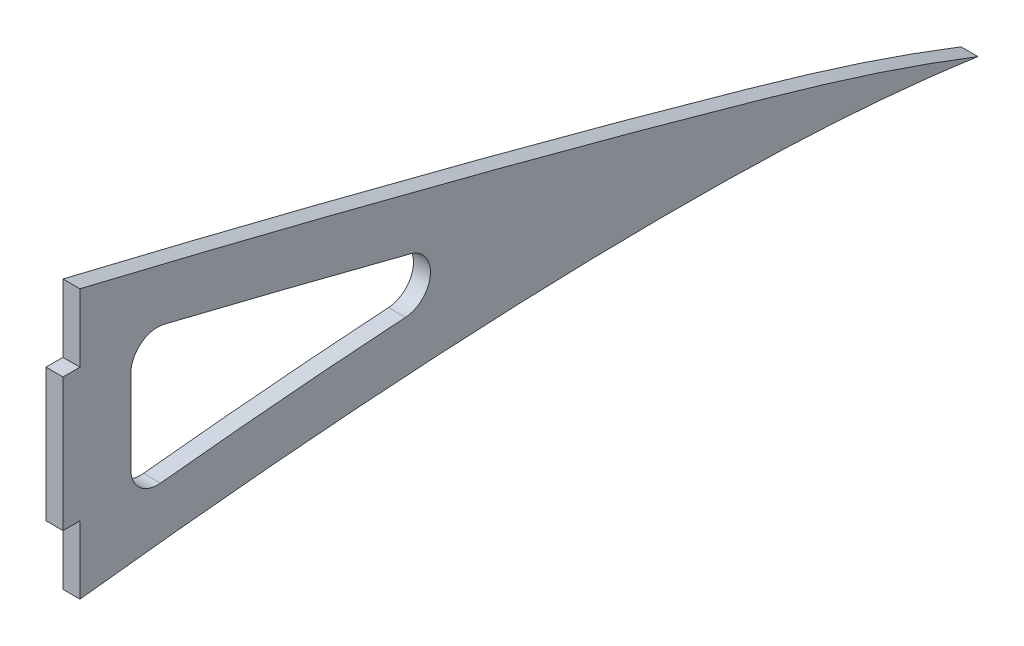
ISO-10303-21;
HEADER;
FILE_DESCRIPTION(('STEP AP214'),'2;1');
FILE_NAME('part.step','',(''),(''),'','','');
FILE_SCHEMA(('AUTOMOTIVE_DESIGN { 1 0 10303 214 1 1 1 1 }'));
ENDSEC;
DATA;
#1=APPLICATION_CONTEXT('core data for automotive mechanical design processes');
#2=APPLICATION_PROTOCOL_DEFINITION('international standard','automotive_design',2000,#1);
#3=PRODUCT_CONTEXT('',#1,'mechanical');
#4=PRODUCT('Part','Part','',(#3));
#5=PRODUCT_RELATED_PRODUCT_CATEGORY('part','',(#4));
#6=PRODUCT_DEFINITION_FORMATION('','',#4);
#7=PRODUCT_DEFINITION_CONTEXT('part definition',#1,'design');
#8=PRODUCT_DEFINITION('design','',#6,#7);
#9=PRODUCT_DEFINITION_SHAPE('','',#8);
#10=(LENGTH_UNIT() NAMED_UNIT(*) SI_UNIT(.MILLI.,.METRE.));
#11=(NAMED_UNIT(*) PLANE_ANGLE_UNIT() SI_UNIT($,.RADIAN.));
#12=(NAMED_UNIT(*) SI_UNIT($,.STERADIAN.) SOLID_ANGLE_UNIT());
#13=UNCERTAINTY_MEASURE_WITH_UNIT(LENGTH_MEASURE(1.E-05),#10,'distance_accuracy_value','');
#14=(GEOMETRIC_REPRESENTATION_CONTEXT(3) GLOBAL_UNCERTAINTY_ASSIGNED_CONTEXT((#13)) GLOBAL_UNIT_ASSIGNED_CONTEXT((#10,
#11,#12)) REPRESENTATION_CONTEXT('',''));
#15=CARTESIAN_POINT('',(0.,0.,0.));
#16=DIRECTION('',(0.,0.,1.));
#17=DIRECTION('',(1.,0.,0.));
#18=AXIS2_PLACEMENT_3D('',#15,#16,#17);
#19=CARTESIAN_POINT('',(1.5875,0.,0.));
#20=DIRECTION('',(1.,0.,0.));
#21=DIRECTION('',(0.,0.,-1.));
#22=AXIS2_PLACEMENT_3D('',#19,#20,#21);
#23=PLANE('',#22);
#24=DIRECTION('',(0.,1.,1.66096358014787E-13));
#25=VECTOR('',#24,1.);
#26=CARTESIAN_POINT('',(1.5875,1.02331310656789E-10,-616.096053398588));
#27=LINE('',#26,#25);
#28=CARTESIAN_POINT('',(1.5875,-27.0322599546339,-616.096053398592));
#29=VERTEX_POINT('',#28);
#30=CARTESIAN_POINT('',(1.5875,-14.3322599546339,-616.09605339859));
#31=VERTEX_POINT('',#30);
#32=EDGE_CURVE('E134',#29,#31,#27,.T.);
#33=ORIENTED_EDGE('',*,*,#32,.F.);
#34=CARTESIAN_POINT('',(1.5875,-0.0168698697803817,-1.58896756731634));
#35=CARTESIAN_POINT('',(1.5875,-0.278093575405853,-1.59778567538342));
#36=CARTESIAN_POINT('',(1.5875,-0.817071560687652,-1.61698852295705));
#37=CARTESIAN_POINT('',(1.5875,-1.5250777063707,-1.67055282833132));
#38=CARTESIAN_POINT('',(1.5875,-2.23953985681244,-1.77272911801303));
#39=CARTESIAN_POINT('',(1.5875,-3.2170399545111,-1.96449824112025));
#40=CARTESIAN_POINT('',(1.5875,-4.47308667544305,-2.28220569209763));
#41=CARTESIAN_POINT('',(1.5875,-6.45569044251883,-2.89195735088694));
#42=CARTESIAN_POINT('',(1.5875,-8.91270651117956,-3.82502314776842));
#43=CARTESIAN_POINT('',(1.5875,-12.764870838745,-5.5748206630622));
#44=CARTESIAN_POINT('',(1.5875,-17.4946939025467,-8.15485573251682));
#45=CARTESIAN_POINT('',(1.5875,-25.0362925123383,-12.5101141172109));
#46=CARTESIAN_POINT('',(1.5875,-34.2942736430627,-18.1123469115671));
#47=CARTESIAN_POINT('',(1.5875,-45.1810251619868,-25.230105591362));
#48=CARTESIAN_POINT('',(1.5875,-53.8227317037622,-31.689080193494));
#49=CARTESIAN_POINT('',(1.5875,-60.4726069561864,-37.2128263714012));
#50=CARTESIAN_POINT('',(1.5875,-66.962933883926,-42.9501181028563));
#51=CARTESIAN_POINT('',(1.5875,-74.4394415189749,-50.6018486257846));
#52=CARTESIAN_POINT('',(1.5875,-81.5128401744618,-61.3489491705267));
#53=CARTESIAN_POINT('',(1.5875,-86.5672767678429,-73.159446713042));
#54=CARTESIAN_POINT('',(1.5875,-90.1112052326867,-85.6410448979768));
#55=CARTESIAN_POINT('',(1.5875,-92.857558138955,-98.3222524640694));
#56=CARTESIAN_POINT('',(1.5875,-95.4884593166877,-115.423728280371));
#57=CARTESIAN_POINT('',(1.5875,-97.1574166185787,-137.057042994171));
#58=CARTESIAN_POINT('',(1.5875,-97.3913575328663,-163.09710904146));
#59=CARTESIAN_POINT('',(1.5875,-96.2564047503436,-189.13539327614));
#60=CARTESIAN_POINT('',(1.5875,-94.0860606996018,-215.119495237718));
#61=CARTESIAN_POINT('',(1.5875,-91.1098097619557,-241.033805840036));
#62=CARTESIAN_POINT('',(1.5875,-86.3075505253941,-275.492090275555));
#63=CARTESIAN_POINT('',(1.5875,-79.1224787107728,-318.404073319138));
#64=CARTESIAN_POINT('',(1.5875,-69.4844112272533,-369.735601224399));
#65=CARTESIAN_POINT('',(1.5875,-59.4768027176839,-421.013521647914));
#66=CARTESIAN_POINT('',(1.5875,-49.6150737617801,-472.334965082267));
#67=CARTESIAN_POINT('',(1.5875,-40.3589258634731,-523.784524343132));
#68=CARTESIAN_POINT('',(1.5875,-33.4141676050394,-567.397032140983));
#69=CARTESIAN_POINT('',(1.5875,-28.6192917774646,-602.524816758193));
#70=CARTESIAN_POINT('',(1.5875,-24.5175461399527,-637.156841221714));
#71=CARTESIAN_POINT('',(1.5875,-21.4749055065338,-671.327266418194));
#72=CARTESIAN_POINT('',(1.5875,-19.8162969755378,-705.603952790565));
#73=CARTESIAN_POINT('',(1.5875,-19.41220767749,-731.78903132868));
#74=CARTESIAN_POINT('',(1.5875,-20.1502189024007,-758.00034587372));
#75=CARTESIAN_POINT('',(1.5875,-21.867269156407,-775.446944988084));
#76=CARTESIAN_POINT('',(1.5875,-23.1184231765888,-784.106482277342));
#77=B_SPLINE_CURVE_WITH_KNOTS('',3,(#34,#35,#36,#37,#38,#39,#40,#41,#42,#43,#44,#45,#46,#47,#48,
#49,#50,#51,#52,#53,#54,#55,#56,#57,#58,#59,#60,#61,#62,#63,#64,#65,#66,#67,#68,#69,#70,#71,#72,
#73,#74,#75,#76),.UNSPECIFIED.,.F.,.F.,(4,1,1,1,1,1,1,1,1,1,1,1,1,1,1,1,1,1,1,1,1,1,1,1,1,1,1,1,
1,1,1,1,1,1,1,1,1,1,1,1,4),(8.23654502113766E-05,0.00103762246756374,0.00199287948491611,
0.00294813650226847,0.00390339351962084,0.00581390755432556,0.00772442158903029,
0.0115454496584398,0.0153664777278492,0.0230085338666681,0.030650590005487,0.0459347022831249,
0.0612188145607627,0.0765029268384006,0.0841449829772195,0.0917870391160384,0.107071151393676,
0.122355263671314,0.137639375948952,0.15292348822659,0.168207600504228,0.183491712781865,
0.214059937337141,0.244628161892417,0.275196386447692,0.305764611002968,0.336332835558244,
0.366901060113519,0.428037509224071,0.489173958334622,0.550310407445173,0.611446856555725,
0.672583305666276,0.733719754776827,0.766341569027321,0.796909793582597,0.85599265299793,
0.886560877553206,0.917129102108482,0.947697326663757,0.978265551219033),.UNSPECIFIED.);
#78=CARTESIAN_POINT('',(1.5875,-23.1184231765888,-784.106482277342));
#79=VERTEX_POINT('',#78);
#80=EDGE_CURVE('E144',#29,#79,#77,.T.);
#81=ORIENTED_EDGE('',*,*,#80,.T.);
#82=CARTESIAN_POINT('',(1.5875,-23.1184231765888,-784.106482277342));
#83=CARTESIAN_POINT('',(1.5875,-21.5941948646314,-780.160330066746));
#84=CARTESIAN_POINT('',(1.5875,-18.6420313640257,-772.229019430764));
#85=CARTESIAN_POINT('',(1.5875,-14.6721592573552,-760.174514143023));
#86=CARTESIAN_POINT('',(1.5875,-11.061270892252,-747.991113763068));
#87=CARTESIAN_POINT('',(1.5875,-6.45595444735922,-731.645658465396));
#88=CARTESIAN_POINT('',(1.5875,-0.845295728828582,-711.176791695));
#89=CARTESIAN_POINT('',(1.5875,7.48755270465738,-679.558994763352));
#90=CARTESIAN_POINT('',(1.5875,14.4995617444176,-651.983641843664));
#91=CARTESIAN_POINT('',(1.5875,21.2911002500126,-624.354900685818));
#92=CARTESIAN_POINT('',(1.5875,25.5546603839251,-606.604777538299));
#93=CARTESIAN_POINT('',(1.5875,32.596548420524,-576.424151958469));
#94=CARTESIAN_POINT('',(1.5875,41.1374524116112,-537.877742251688));
#95=CARTESIAN_POINT('',(1.5875,51.0911698472495,-487.918910070674));
#96=CARTESIAN_POINT('',(1.5875,59.7239737986415,-437.720761599895));
#97=CARTESIAN_POINT('',(1.5875,66.7289053590127,-387.278741139135));
#98=CARTESIAN_POINT('',(1.5875,70.9360377288318,-345.050560772716));
#99=CARTESIAN_POINT('',(1.5875,73.0641477653892,-311.18788932569));
#100=CARTESIAN_POINT('',(1.5875,74.2092196354668,-277.279562300467));
#101=CARTESIAN_POINT('',(1.5875,73.8800008847884,-243.342738652409));
#102=CARTESIAN_POINT('',(1.5875,71.9586220108794,-209.476353678726));
#103=CARTESIAN_POINT('',(1.5875,69.6475228760495,-184.143820783248));
#104=CARTESIAN_POINT('',(1.5875,66.4677558472745,-158.904994034112));
#105=CARTESIAN_POINT('',(1.5875,62.3586391617327,-133.8071867013));
#106=CARTESIAN_POINT('',(1.5875,57.1874016990518,-108.915504076387));
#107=CARTESIAN_POINT('',(1.5875,51.8354380146184,-88.4250104282845));
#108=CARTESIAN_POINT('',(1.5875,46.781142415969,-72.2737715807522));
#109=CARTESIAN_POINT('',(1.5875,42.5401308058817,-60.3184424568568));
#110=CARTESIAN_POINT('',(1.5875,37.7737253953122,-48.577097756103));
#111=CARTESIAN_POINT('',(1.5875,32.3878283625538,-37.1196846287895));
#112=CARTESIAN_POINT('',(1.5875,27.2537575462737,-27.9271564923142));
#113=CARTESIAN_POINT('',(1.5875,22.6553737471211,-20.9063850305832));
#114=CARTESIAN_POINT('',(1.5875,18.9075077927961,-15.8717047100105));
#115=CARTESIAN_POINT('',(1.5875,14.8240531255331,-11.1186200473068));
#116=CARTESIAN_POINT('',(1.5875,11.0807152552971,-7.55821558571599));
#117=CARTESIAN_POINT('',(1.5875,7.83489505129662,-5.02510578688502));
#118=CARTESIAN_POINT('',(1.5875,5.29547537768222,-3.38923844421585));
#119=CARTESIAN_POINT('',(1.5875,3.06142620290842,-2.31109107008206));
#120=CARTESIAN_POINT('',(1.5875,1.48593186176602,-1.80559091181272));
#121=CARTESIAN_POINT('',(1.5875,0.72579482126348,-1.65397388534357));
#122=CARTESIAN_POINT('',(1.5875,0.34989447911426,-1.61043534130219));
#123=CARTESIAN_POINT('',(1.5875,0.100324503404875,-1.59546044383819));
#124=CARTESIAN_POINT('',(1.5875,-0.0168698697803871,-1.58896756731634));
#125=B_SPLINE_CURVE_WITH_KNOTS('',3,(#82,#83,#84,#85,#86,#87,#88,#89,#90,#91,#92,#93,#94,#95,
#96,#97,#98,#99,#100,#101,#102,#103,#104,#105,#106,#107,#108,#109,#110,#111,#112,#113,#114,#115,
#116,#117,#118,#119,#120,#121,#122,#123,#124),.UNSPECIFIED.,.F.,.F.,(4,1,1,1,1,1,1,1,1,1,1,1,1,
1,1,1,1,1,1,1,1,1,1,1,1,1,1,1,1,1,1,1,1,1,1,1,1,1,1,1,4),(0.0222996498274626,0.0375748876942013,
0.05285012556094,0.0681253634276787,0.0834006012944174,0.113951077027895,0.144501552761372,
0.201029282441029,0.216304520307768,0.246854996041246,0.266703455695282,0.327804407162237,
0.388905358629191,0.450006310096146,0.511107261563101,0.572208213030056,0.602758688763533,
0.633309164497011,0.694410115963965,0.724960591697443,0.75551106743092,0.786061543164398,
0.816612018897875,0.847162494631353,0.87771297036483,0.892988208231569,0.908263446098307,
0.923538683965046,0.938813921831785,0.954089159698523,0.961726778631893,0.969364397565262,
0.977002016498631,0.984639635432001,0.988458444898685,0.99227725436537,0.996096063832055,
0.998005468565397,0.998960170932068,0.999437522115404,0.999914873298739),.UNSPECIFIED.);
#126=CARTESIAN_POINT('',(1.5875,23.2667001377275,-616.09605339859));
#127=VERTEX_POINT('',#126);
#128=EDGE_CURVE('E149',#79,#127,#125,.T.);
#129=ORIENTED_EDGE('',*,*,#128,.T.);
#130=DIRECTION('',(0.,-1.,0.));
#131=VECTOR('',#130,1.);
#132=CARTESIAN_POINT('',(1.5875,0.,-616.09605339859));
#133=LINE('',#132,#131);
#134=CARTESIAN_POINT('',(1.5875,10.5667001377275,-616.09605339859));
#135=VERTEX_POINT('',#134);
#136=EDGE_CURVE('E440',#127,#135,#133,.T.);
#137=ORIENTED_EDGE('',*,*,#136,.T.);
#138=DIRECTION('',(0.,0.,1.));
#139=VECTOR('',#138,1.);
#140=CARTESIAN_POINT('',(1.5875,10.5667001377275,0.));
#141=LINE('',#140,#139);
#142=CARTESIAN_POINT('',(1.5875,10.5667001377275,-612.921053398607));
#143=VERTEX_POINT('',#142);
#144=EDGE_CURVE('E240',#135,#143,#141,.T.);
#145=ORIENTED_EDGE('',*,*,#144,.T.);
#146=DIRECTION('',(0.,-1.,0.));
#147=VECTOR('',#146,1.);
#148=CARTESIAN_POINT('',(1.5875,0.,-612.921053398607));
#149=LINE('',#148,#147);
#150=CARTESIAN_POINT('',(1.5875,-14.3322599546339,-612.921053398607));
#151=VERTEX_POINT('',#150);
#152=EDGE_CURVE('E441',#143,#151,#149,.T.);
#153=ORIENTED_EDGE('',*,*,#152,.T.);
#154=DIRECTION('',(0.,0.,1.));
#155=VECTOR('',#154,1.);
#156=CARTESIAN_POINT('',(1.5875,-14.3322599546339,0.));
#157=LINE('',#156,#155);
#158=EDGE_CURVE('E152',#31,#151,#157,.T.);
#159=ORIENTED_EDGE('',*,*,#158,.F.);
#160=EDGE_LOOP('',(#33,#81,#129,#137,#145,#153,#159));
#161=FACE_BOUND('',#160,.T.);
#162=CARTESIAN_POINT('',(1.5875,-16.3575336813235,-625.62105339859));
#163=CARTESIAN_POINT('',(1.5875,-15.5904703771703,-632.578353092105));
#164=CARTESIAN_POINT('',(1.5875,-14.1649136416022,-646.49830930104));
#165=CARTESIAN_POINT('',(1.5875,-12.4003350236003,-667.454887979884));
#166=CARTESIAN_POINT('',(1.5875,-11.0652895824429,-688.462893644439));
#167=CARTESIAN_POINT('',(1.5875,-10.5016999291603,-702.52523707711));
#168=CARTESIAN_POINT('',(1.5875,-10.315598480717,-709.553781788835));
#169=B_SPLINE_CURVE_WITH_KNOTS('',3,(#162,#163,#164,#165,#166,#167,#168),.UNSPECIFIED.,.F.,.F.,
(4,1,1,1,4),(0.868429491787277,0.892780478576909,0.91713146536654,0.941482452156172,
0.965833438945803),.UNSPECIFIED.);
#170=CARTESIAN_POINT('',(1.5875,-15.759804026355,-631.148140493534));
#171=VERTEX_POINT('',#170);
#172=CARTESIAN_POINT('',(1.5875,-11.8137429156262,-676.991682383172));
#173=VERTEX_POINT('',#172);
#174=EDGE_CURVE('E302',#171,#173,#169,.T.);
#175=ORIENTED_EDGE('',*,*,#174,.F.);
#176=CARTESIAN_POINT('',(1.5875,-10.7876637231913,-630.621053398591));
#177=DIRECTION('',(1.,0.,0.));
#178=DIRECTION('',(0.,0.,-1.));
#179=AXIS2_PLACEMENT_3D('',#176,#177,#178);
#180=CIRCLE('',#179,5.);
#181=CARTESIAN_POINT('',(1.5875,-10.787663723191,-625.621053398591));
#182=VERTEX_POINT('',#181);
#183=EDGE_CURVE('E294',#171,#182,#180,.F.);
#184=ORIENTED_EDGE('',*,*,#183,.T.);
#185=DIRECTION('',(0.,1.,0.));
#186=VECTOR('',#185,1.);
#187=CARTESIAN_POINT('',(1.5875,-3.42955566459981E-11,-625.621053398591));
#188=LINE('',#187,#186);
#189=CARTESIAN_POINT('',(1.5875,4.79146153073402,-625.621053398591));
#190=VERTEX_POINT('',#189);
#191=EDGE_CURVE('E159',#182,#190,#188,.T.);
#192=ORIENTED_EDGE('',*,*,#191,.T.);
#193=CARTESIAN_POINT('',(1.5875,4.79146153073375,-630.621053398591));
#194=DIRECTION('',(1.,0.,0.));
#195=DIRECTION('',(0.,0.,-1.));
#196=AXIS2_PLACEMENT_3D('',#193,#194,#195);
#197=CIRCLE('',#196,5.);
#198=CARTESIAN_POINT('',(1.5875,9.64713860821345,-631.813697569851));
#199=VERTEX_POINT('',#198);
#200=EDGE_CURVE('E290',#190,#199,#197,.F.);
#201=ORIENTED_EDGE('',*,*,#200,.T.);
#202=CARTESIAN_POINT('',(1.5875,-10.3155984807162,-709.553781788835));
#203=CARTESIAN_POINT('',(1.5875,-8.43995555525189,-702.586088902207));
#204=CARTESIAN_POINT('',(1.5875,-4.7501921348085,-688.640319727921));
#205=CARTESIAN_POINT('',(1.5875,0.677236446832701,-667.656705927766));
#206=CARTESIAN_POINT('',(1.5875,5.99049495392709,-646.655315148198));
#207=CARTESIAN_POINT('',(1.5875,9.45246021576622,-632.63602090243));
#208=CARTESIAN_POINT('',(1.5875,11.1624228940006,-625.62105339859));
#209=B_SPLINE_CURVE_WITH_KNOTS('',3,(#202,#203,#204,#205,#206,#207,#208),.UNSPECIFIED.,.F.,.F.,
(4,1,1,1,4),(0.0368347002097667,0.0628766939765419,0.0889186877433172,0.114960681510092,
0.141002675276868),.UNSPECIFIED.);
#210=CARTESIAN_POINT('',(1.5875,-1.98327888413139,-677.923278998654));
#211=VERTEX_POINT('',#210);
#212=EDGE_CURVE('E303',#211,#199,#209,.T.);
#213=ORIENTED_EDGE('',*,*,#212,.F.);
#214=CARTESIAN_POINT('',(1.5875,-6.82401372439192,-676.671365979995));
#215=DIRECTION('',(1.,0.,0.));
#216=DIRECTION('',(0.,0.,-1.));
#217=AXIS2_PLACEMENT_3D('',#214,#215,#216);
#218=CIRCLE('',#217,5.);
#219=EDGE_CURVE('E11',#211,#173,#218,.F.);
#220=ORIENTED_EDGE('',*,*,#219,.T.);
#221=EDGE_LOOP('',(#175,#184,#192,#201,#213,#220));
#222=FACE_BOUND('',#221,.T.);
#223=ADVANCED_FACE('F35',(#161,#222),#23,.T.);
#224=CARTESIAN_POINT('',(-1.5875,0.,0.));
#225=DIRECTION('',(1.,0.,0.));
#226=DIRECTION('',(0.,0.,-1.));
#227=AXIS2_PLACEMENT_3D('',#224,#225,#226);
#228=PLANE('',#227);
#229=DIRECTION('',(0.,1.,1.66096358014787E-13));
#230=VECTOR('',#229,1.);
#231=CARTESIAN_POINT('',(-1.5875,1.02331310656789E-10,-616.096053398588));
#232=LINE('',#231,#230);
#233=CARTESIAN_POINT('',(-1.5875,-27.0322599546339,-616.096053398592));
#234=VERTEX_POINT('',#233);
#235=CARTESIAN_POINT('',(-1.5875,-14.3322599546339,-616.09605339859));
#236=VERTEX_POINT('',#235);
#237=EDGE_CURVE('E137',#234,#236,#232,.T.);
#238=ORIENTED_EDGE('',*,*,#237,.T.);
#239=DIRECTION('',(0.,0.,1.));
#240=VECTOR('',#239,1.);
#241=CARTESIAN_POINT('',(-1.5875,-14.3322599546339,0.));
#242=LINE('',#241,#240);
#243=CARTESIAN_POINT('',(-1.5875,-14.3322599546339,-612.921053398607));
#244=VERTEX_POINT('',#243);
#245=EDGE_CURVE('E153',#236,#244,#242,.T.);
#246=ORIENTED_EDGE('',*,*,#245,.T.);
#247=DIRECTION('',(0.,-1.,0.));
#248=VECTOR('',#247,1.);
#249=CARTESIAN_POINT('',(-1.5875,0.,-612.921053398607));
#250=LINE('',#249,#248);
#251=CARTESIAN_POINT('',(-1.5875,10.5667001377275,-612.921053398607));
#252=VERTEX_POINT('',#251);
#253=EDGE_CURVE('E156',#252,#244,#250,.T.);
#254=ORIENTED_EDGE('',*,*,#253,.F.);
#255=DIRECTION('',(0.,0.,1.));
#256=VECTOR('',#255,1.);
#257=CARTESIAN_POINT('',(-1.5875,10.5667001377275,0.));
#258=LINE('',#257,#256);
#259=CARTESIAN_POINT('',(-1.5875,10.5667001377275,-616.09605339859));
#260=VERTEX_POINT('',#259);
#261=EDGE_CURVE('E235',#260,#252,#258,.T.);
#262=ORIENTED_EDGE('',*,*,#261,.F.);
#263=DIRECTION('',(0.,-1.,0.));
#264=VECTOR('',#263,1.);
#265=CARTESIAN_POINT('',(-1.5875,0.,-616.09605339859));
#266=LINE('',#265,#264);
#267=CARTESIAN_POINT('',(-1.5875,23.2667001377275,-616.09605339859));
#268=VERTEX_POINT('',#267);
#269=EDGE_CURVE('E226',#268,#260,#266,.T.);
#270=ORIENTED_EDGE('',*,*,#269,.F.);
#271=CARTESIAN_POINT('',(-1.5875,-23.1184231765888,-784.106482277342));
#272=CARTESIAN_POINT('',(-1.5875,-21.5941948646314,-780.160330066746));
#273=CARTESIAN_POINT('',(-1.5875,-18.6420313640257,-772.229019430764));
#274=CARTESIAN_POINT('',(-1.5875,-14.6721592573552,-760.174514143023));
#275=CARTESIAN_POINT('',(-1.5875,-11.061270892252,-747.991113763068));
#276=CARTESIAN_POINT('',(-1.5875,-6.45595444735922,-731.645658465396));
#277=CARTESIAN_POINT('',(-1.5875,-0.845295728828582,-711.176791695));
#278=CARTESIAN_POINT('',(-1.5875,7.48755270465738,-679.558994763352));
#279=CARTESIAN_POINT('',(-1.5875,14.4995617444176,-651.983641843664));
#280=CARTESIAN_POINT('',(-1.5875,21.2911002500126,-624.354900685818));
#281=CARTESIAN_POINT('',(-1.5875,25.5546603839251,-606.604777538299));
#282=CARTESIAN_POINT('',(-1.5875,32.596548420524,-576.424151958469));
#283=CARTESIAN_POINT('',(-1.5875,41.1374524116112,-537.877742251688));
#284=CARTESIAN_POINT('',(-1.5875,51.0911698472495,-487.918910070674));
#285=CARTESIAN_POINT('',(-1.5875,59.7239737986415,-437.720761599895));
#286=CARTESIAN_POINT('',(-1.5875,66.7289053590127,-387.278741139135));
#287=CARTESIAN_POINT('',(-1.5875,70.9360377288318,-345.050560772716));
#288=CARTESIAN_POINT('',(-1.5875,73.0641477653892,-311.18788932569));
#289=CARTESIAN_POINT('',(-1.5875,74.2092196354668,-277.279562300467));
#290=CARTESIAN_POINT('',(-1.5875,73.8800008847884,-243.342738652409));
#291=CARTESIAN_POINT('',(-1.5875,71.9586220108794,-209.476353678726));
#292=CARTESIAN_POINT('',(-1.5875,69.6475228760495,-184.143820783248));
#293=CARTESIAN_POINT('',(-1.5875,66.4677558472745,-158.904994034112));
#294=CARTESIAN_POINT('',(-1.5875,62.3586391617327,-133.8071867013));
#295=CARTESIAN_POINT('',(-1.5875,57.1874016990518,-108.915504076387));
#296=CARTESIAN_POINT('',(-1.5875,51.8354380146184,-88.4250104282845));
#297=CARTESIAN_POINT('',(-1.5875,46.781142415969,-72.2737715807522));
#298=CARTESIAN_POINT('',(-1.5875,42.5401308058817,-60.3184424568568));
#299=CARTESIAN_POINT('',(-1.5875,37.7737253953122,-48.577097756103));
#300=CARTESIAN_POINT('',(-1.5875,32.3878283625538,-37.1196846287895));
#301=CARTESIAN_POINT('',(-1.5875,27.2537575462737,-27.9271564923142));
#302=CARTESIAN_POINT('',(-1.5875,22.6553737471211,-20.9063850305832));
#303=CARTESIAN_POINT('',(-1.5875,18.9075077927961,-15.8717047100105));
#304=CARTESIAN_POINT('',(-1.5875,14.8240531255331,-11.1186200473068));
#305=CARTESIAN_POINT('',(-1.5875,11.0807152552971,-7.55821558571599));
#306=CARTESIAN_POINT('',(-1.5875,7.83489505129662,-5.02510578688502));
#307=CARTESIAN_POINT('',(-1.5875,5.29547537768222,-3.38923844421585));
#308=CARTESIAN_POINT('',(-1.5875,3.06142620290842,-2.31109107008206));
#309=CARTESIAN_POINT('',(-1.5875,1.48593186176602,-1.80559091181272));
#310=CARTESIAN_POINT('',(-1.5875,0.72579482126348,-1.65397388534357));
#311=CARTESIAN_POINT('',(-1.5875,0.34989447911426,-1.61043534130219));
#312=CARTESIAN_POINT('',(-1.5875,0.100324503404875,-1.59546044383819));
#313=CARTESIAN_POINT('',(-1.5875,-0.0168698697803871,-1.58896756731634));
#314=B_SPLINE_CURVE_WITH_KNOTS('',3,(#271,#272,#273,#274,#275,#276,#277,#278,#279,#280,#281,
#282,#283,#284,#285,#286,#287,#288,#289,#290,#291,#292,#293,#294,#295,#296,#297,#298,#299,#300,
#301,#302,#303,#304,#305,#306,#307,#308,#309,#310,#311,#312,#313),.UNSPECIFIED.,.F.,.F.,(4,1,1,
1,1,1,1,1,1,1,1,1,1,1,1,1,1,1,1,1,1,1,1,1,1,1,1,1,1,1,1,1,1,1,1,1,1,1,1,1,4),
(0.0222996498274626,0.0375748876942013,0.05285012556094,0.0681253634276787,0.0834006012944174,
0.113951077027895,0.144501552761372,0.201029282441029,0.216304520307768,0.246854996041246,
0.266703455695282,0.327804407162237,0.388905358629191,0.450006310096146,0.511107261563101,
0.572208213030056,0.602758688763533,0.633309164497011,0.694410115963965,0.724960591697443,
0.75551106743092,0.786061543164398,0.816612018897875,0.847162494631353,0.87771297036483,
0.892988208231569,0.908263446098307,0.923538683965046,0.938813921831785,0.954089159698523,
0.961726778631893,0.969364397565262,0.977002016498631,0.984639635432001,0.988458444898685,
0.99227725436537,0.996096063832055,0.998005468565397,0.998960170932068,0.999437522115404,
0.999914873298739),.UNSPECIFIED.);
#315=CARTESIAN_POINT('',(-1.5875,-23.1184231765888,-784.106482277342));
#316=VERTEX_POINT('',#315);
#317=EDGE_CURVE('E236',#316,#268,#314,.T.);
#318=ORIENTED_EDGE('',*,*,#317,.F.);
#319=CARTESIAN_POINT('',(-1.5875,-0.0168698697803817,-1.58896756731634));
#320=CARTESIAN_POINT('',(-1.5875,-0.278093575405853,-1.59778567538342));
#321=CARTESIAN_POINT('',(-1.5875,-0.817071560687652,-1.61698852295705));
#322=CARTESIAN_POINT('',(-1.5875,-1.5250777063707,-1.67055282833132));
#323=CARTESIAN_POINT('',(-1.5875,-2.23953985681244,-1.77272911801303));
#324=CARTESIAN_POINT('',(-1.5875,-3.2170399545111,-1.96449824112025));
#325=CARTESIAN_POINT('',(-1.5875,-4.47308667544305,-2.28220569209763));
#326=CARTESIAN_POINT('',(-1.5875,-6.45569044251883,-2.89195735088694));
#327=CARTESIAN_POINT('',(-1.5875,-8.91270651117956,-3.82502314776842));
#328=CARTESIAN_POINT('',(-1.5875,-12.764870838745,-5.5748206630622));
#329=CARTESIAN_POINT('',(-1.5875,-17.4946939025467,-8.15485573251682));
#330=CARTESIAN_POINT('',(-1.5875,-25.0362925123383,-12.5101141172109));
#331=CARTESIAN_POINT('',(-1.5875,-34.2942736430627,-18.1123469115671));
#332=CARTESIAN_POINT('',(-1.5875,-45.1810251619868,-25.230105591362));
#333=CARTESIAN_POINT('',(-1.5875,-53.8227317037622,-31.689080193494));
#334=CARTESIAN_POINT('',(-1.5875,-60.4726069561864,-37.2128263714012));
#335=CARTESIAN_POINT('',(-1.5875,-66.962933883926,-42.9501181028563));
#336=CARTESIAN_POINT('',(-1.5875,-74.4394415189749,-50.6018486257846));
#337=CARTESIAN_POINT('',(-1.5875,-81.5128401744618,-61.3489491705267));
#338=CARTESIAN_POINT('',(-1.5875,-86.5672767678429,-73.159446713042));
#339=CARTESIAN_POINT('',(-1.5875,-90.1112052326867,-85.6410448979768));
#340=CARTESIAN_POINT('',(-1.5875,-92.857558138955,-98.3222524640694));
#341=CARTESIAN_POINT('',(-1.5875,-95.4884593166877,-115.423728280371));
#342=CARTESIAN_POINT('',(-1.5875,-97.1574166185787,-137.057042994171));
#343=CARTESIAN_POINT('',(-1.5875,-97.3913575328663,-163.09710904146));
#344=CARTESIAN_POINT('',(-1.5875,-96.2564047503436,-189.13539327614));
#345=CARTESIAN_POINT('',(-1.5875,-94.0860606996018,-215.119495237718));
#346=CARTESIAN_POINT('',(-1.5875,-91.1098097619557,-241.033805840036));
#347=CARTESIAN_POINT('',(-1.5875,-86.3075505253941,-275.492090275555));
#348=CARTESIAN_POINT('',(-1.5875,-79.1224787107728,-318.404073319138));
#349=CARTESIAN_POINT('',(-1.5875,-69.4844112272533,-369.735601224399));
#350=CARTESIAN_POINT('',(-1.5875,-59.4768027176839,-421.013521647914));
#351=CARTESIAN_POINT('',(-1.5875,-49.6150737617801,-472.334965082267));
#352=CARTESIAN_POINT('',(-1.5875,-40.3589258634731,-523.784524343132));
#353=CARTESIAN_POINT('',(-1.5875,-33.4141676050394,-567.397032140983));
#354=CARTESIAN_POINT('',(-1.5875,-28.6192917774646,-602.524816758193));
#355=CARTESIAN_POINT('',(-1.5875,-24.5175461399527,-637.156841221714));
#356=CARTESIAN_POINT('',(-1.5875,-21.4749055065338,-671.327266418194));
#357=CARTESIAN_POINT('',(-1.5875,-19.8162969755378,-705.603952790565));
#358=CARTESIAN_POINT('',(-1.5875,-19.41220767749,-731.78903132868));
#359=CARTESIAN_POINT('',(-1.5875,-20.1502189024007,-758.00034587372));
#360=CARTESIAN_POINT('',(-1.5875,-21.867269156407,-775.446944988084));
#361=CARTESIAN_POINT('',(-1.5875,-23.1184231765888,-784.106482277342));
#362=B_SPLINE_CURVE_WITH_KNOTS('',3,(#319,#320,#321,#322,#323,#324,#325,#326,#327,#328,#329,
#330,#331,#332,#333,#334,#335,#336,#337,#338,#339,#340,#341,#342,#343,#344,#345,#346,#347,#348,
#349,#350,#351,#352,#353,#354,#355,#356,#357,#358,#359,#360,#361),.UNSPECIFIED.,.F.,.F.,(4,1,1,
1,1,1,1,1,1,1,1,1,1,1,1,1,1,1,1,1,1,1,1,1,1,1,1,1,1,1,1,1,1,1,1,1,1,1,1,1,4),
(8.23654502113766E-05,0.00103762246756374,0.00199287948491611,0.00294813650226847,
0.00390339351962084,0.00581390755432556,0.00772442158903029,0.0115454496584398,
0.0153664777278492,0.0230085338666681,0.030650590005487,0.0459347022831249,0.0612188145607627,
0.0765029268384006,0.0841449829772195,0.0917870391160384,0.107071151393676,0.122355263671314,
0.137639375948952,0.15292348822659,0.168207600504228,0.183491712781865,0.214059937337141,
0.244628161892417,0.275196386447692,0.305764611002968,0.336332835558244,0.366901060113519,
0.428037509224071,0.489173958334622,0.550310407445173,0.611446856555725,0.672583305666276,
0.733719754776827,0.766341569027321,0.796909793582597,0.85599265299793,0.886560877553206,
0.917129102108482,0.947697326663757,0.978265551219033),.UNSPECIFIED.);
#363=EDGE_CURVE('E424',#234,#316,#362,.T.);
#364=ORIENTED_EDGE('',*,*,#363,.F.);
#365=EDGE_LOOP('',(#238,#246,#254,#262,#270,#318,#364));
#366=FACE_BOUND('',#365,.T.);
#367=CARTESIAN_POINT('',(-1.5875,-10.3155984807162,-709.553781788835));
#368=CARTESIAN_POINT('',(-1.5875,-8.43995555525189,-702.586088902207));
#369=CARTESIAN_POINT('',(-1.5875,-4.7501921348085,-688.640319727921));
#370=CARTESIAN_POINT('',(-1.5875,0.677236446832701,-667.656705927766));
#371=CARTESIAN_POINT('',(-1.5875,5.99049495392709,-646.655315148198));
#372=CARTESIAN_POINT('',(-1.5875,9.45246021576622,-632.63602090243));
#373=CARTESIAN_POINT('',(-1.5875,11.1624228940006,-625.62105339859));
#374=B_SPLINE_CURVE_WITH_KNOTS('',3,(#367,#368,#369,#370,#371,#372,#373),.UNSPECIFIED.,.F.,.F.,
(4,1,1,1,4),(0.0368347002097667,0.0628766939765419,0.0889186877433172,0.114960681510092,
0.141002675276868),.UNSPECIFIED.);
#375=CARTESIAN_POINT('',(-1.5875,9.64713860821345,-631.813697569851));
#376=VERTEX_POINT('',#375);
#377=CARTESIAN_POINT('',(-1.5875,-1.98327888413139,-677.923278998654));
#378=VERTEX_POINT('',#377);
#379=EDGE_CURVE('E266',#376,#378,#374,.F.);
#380=ORIENTED_EDGE('',*,*,#379,.F.);
#381=CARTESIAN_POINT('',(-1.5875,4.79146153073375,-630.621053398591));
#382=DIRECTION('',(1.,0.,0.));
#383=DIRECTION('',(0.,0.,-1.));
#384=AXIS2_PLACEMENT_3D('',#381,#382,#383);
#385=CIRCLE('',#384,5.);
#386=CARTESIAN_POINT('',(-1.5875,4.79146153073402,-625.621053398591));
#387=VERTEX_POINT('',#386);
#388=EDGE_CURVE('E288',#376,#387,#385,.T.);
#389=ORIENTED_EDGE('',*,*,#388,.T.);
#390=DIRECTION('',(0.,-1.,0.));
#391=VECTOR('',#390,1.);
#392=CARTESIAN_POINT('',(-1.5875,-3.42955566459981E-11,-625.621053398591));
#393=LINE('',#392,#391);
#394=CARTESIAN_POINT('',(-1.5875,-10.787663723191,-625.621053398591));
#395=VERTEX_POINT('',#394);
#396=EDGE_CURVE('E260',#387,#395,#393,.T.);
#397=ORIENTED_EDGE('',*,*,#396,.T.);
#398=CARTESIAN_POINT('',(-1.5875,-10.7876637231913,-630.621053398591));
#399=DIRECTION('',(1.,0.,0.));
#400=DIRECTION('',(0.,0.,-1.));
#401=AXIS2_PLACEMENT_3D('',#398,#399,#400);
#402=CIRCLE('',#401,5.);
#403=CARTESIAN_POINT('',(-1.5875,-15.759804026355,-631.148140493534));
#404=VERTEX_POINT('',#403);
#405=EDGE_CURVE('E292',#395,#404,#402,.T.);
#406=ORIENTED_EDGE('',*,*,#405,.T.);
#407=CARTESIAN_POINT('',(-1.5875,-16.3575336813235,-625.62105339859));
#408=CARTESIAN_POINT('',(-1.5875,-15.5904703771703,-632.578353092105));
#409=CARTESIAN_POINT('',(-1.5875,-14.1649136416022,-646.49830930104));
#410=CARTESIAN_POINT('',(-1.5875,-12.4003350236003,-667.454887979884));
#411=CARTESIAN_POINT('',(-1.5875,-11.0652895824429,-688.462893644439));
#412=CARTESIAN_POINT('',(-1.5875,-10.5016999291603,-702.52523707711));
#413=CARTESIAN_POINT('',(-1.5875,-10.315598480717,-709.553781788835));
#414=B_SPLINE_CURVE_WITH_KNOTS('',3,(#407,#408,#409,#410,#411,#412,#413),.UNSPECIFIED.,.F.,.F.,
(4,1,1,1,4),(0.868429491787277,0.892780478576909,0.91713146536654,0.941482452156172,
0.965833438945803),.UNSPECIFIED.);
#415=CARTESIAN_POINT('',(-1.5875,-11.8137429156262,-676.991682383172));
#416=VERTEX_POINT('',#415);
#417=EDGE_CURVE('E140',#416,#404,#414,.F.);
#418=ORIENTED_EDGE('',*,*,#417,.F.);
#419=CARTESIAN_POINT('',(-1.5875,-6.82401372439192,-676.671365979995));
#420=DIRECTION('',(1.,0.,0.));
#421=DIRECTION('',(0.,0.,-1.));
#422=AXIS2_PLACEMENT_3D('',#419,#420,#421);
#423=CIRCLE('',#422,5.);
#424=EDGE_CURVE('E43',#416,#378,#423,.T.);
#425=ORIENTED_EDGE('',*,*,#424,.T.);
#426=EDGE_LOOP('',(#380,#389,#397,#406,#418,#425));
#427=FACE_BOUND('',#426,.T.);
#428=ADVANCED_FACE('F180',(#366,#427),#228,.F.);
#429=CARTESIAN_POINT('',(1.5875,1.02331310656789E-10,-616.096053398588));
#430=DIRECTION('',(0.,-1.66096358014787E-13,1.));
#431=DIRECTION('',(0.,-1.,-1.66096358014787E-13));
#432=AXIS2_PLACEMENT_3D('',#429,#430,#431);
#433=PLANE('',#432);
#434=ORIENTED_EDGE('',*,*,#237,.F.);
#435=DIRECTION('',(-1.,0.,0.));
#436=VECTOR('',#435,1.);
#437=CARTESIAN_POINT('',(1.5875,-27.0322599546339,-616.096053398592));
#438=LINE('',#437,#436);
#439=EDGE_CURVE('E130',#29,#234,#438,.T.);
#440=ORIENTED_EDGE('',*,*,#439,.F.);
#441=ORIENTED_EDGE('',*,*,#32,.T.);
#442=DIRECTION('',(-1.,0.,0.));
#443=VECTOR('',#442,1.);
#444=CARTESIAN_POINT('',(1.5875,-14.3322599546339,-616.09605339859));
#445=LINE('',#444,#443);
#446=EDGE_CURVE('E250',#31,#236,#445,.T.);
#447=ORIENTED_EDGE('',*,*,#446,.T.);
#448=EDGE_LOOP('',(#434,#440,#441,#447));
#449=FACE_BOUND('',#448,.T.);
#450=ADVANCED_FACE('F132',(#449),#433,.T.);
#451=DIRECTION('',(-1.,0.,0.));
#452=VECTOR('',#451,1.);
#453=SURFACE_OF_LINEAR_EXTRUSION('',#77,#452);
#454=ORIENTED_EDGE('',*,*,#363,.T.);
#455=DIRECTION('',(-1.,0.,0.));
#456=VECTOR('',#455,1.);
#457=CARTESIAN_POINT('',(1.5875,-23.1184231765888,-784.106482277342));
#458=LINE('',#457,#456);
#459=EDGE_CURVE('E141',#79,#316,#458,.T.);
#460=ORIENTED_EDGE('',*,*,#459,.F.);
#461=ORIENTED_EDGE('',*,*,#80,.F.);
#462=ORIENTED_EDGE('',*,*,#439,.T.);
#463=EDGE_LOOP('',(#454,#460,#461,#462));
#464=FACE_BOUND('',#463,.T.);
#465=ADVANCED_FACE('F145',(#464),#453,.F.);
#466=DIRECTION('',(-1.,0.,0.));
#467=VECTOR('',#466,1.);
#468=SURFACE_OF_LINEAR_EXTRUSION('',#125,#467);
#469=ORIENTED_EDGE('',*,*,#317,.T.);
#470=DIRECTION('',(-1.,0.,0.));
#471=VECTOR('',#470,1.);
#472=CARTESIAN_POINT('',(1.5875,23.2667001377275,-616.09605339859));
#473=LINE('',#472,#471);
#474=EDGE_CURVE('E232',#127,#268,#473,.T.);
#475=ORIENTED_EDGE('',*,*,#474,.F.);
#476=ORIENTED_EDGE('',*,*,#128,.F.);
#477=ORIENTED_EDGE('',*,*,#459,.T.);
#478=EDGE_LOOP('',(#469,#475,#476,#477));
#479=FACE_BOUND('',#478,.T.);
#480=ADVANCED_FACE('F176',(#479),#468,.F.);
#481=CARTESIAN_POINT('',(1.5875,0.,-616.09605339859));
#482=DIRECTION('',(0.,0.,-1.));
#483=DIRECTION('',(-1.,0.,0.));
#484=AXIS2_PLACEMENT_3D('',#481,#482,#483);
#485=PLANE('',#484);
#486=ORIENTED_EDGE('',*,*,#269,.T.);
#487=DIRECTION('',(-1.,0.,0.));
#488=VECTOR('',#487,1.);
#489=CARTESIAN_POINT('',(1.5875,10.5667001377275,-616.09605339859));
#490=LINE('',#489,#488);
#491=EDGE_CURVE('E229',#135,#260,#490,.T.);
#492=ORIENTED_EDGE('',*,*,#491,.F.);
#493=ORIENTED_EDGE('',*,*,#136,.F.);
#494=ORIENTED_EDGE('',*,*,#474,.T.);
#495=EDGE_LOOP('',(#486,#492,#493,#494));
#496=FACE_BOUND('',#495,.T.);
#497=ADVANCED_FACE('F215',(#496),#485,.F.);
#498=CARTESIAN_POINT('',(1.5875,10.5667001377275,0.));
#499=DIRECTION('',(0.,-1.,0.));
#500=DIRECTION('',(0.,0.,-1.));
#501=AXIS2_PLACEMENT_3D('',#498,#499,#500);
#502=PLANE('',#501);
#503=ORIENTED_EDGE('',*,*,#261,.T.);
#504=DIRECTION('',(-1.,0.,0.));
#505=VECTOR('',#504,1.);
#506=CARTESIAN_POINT('',(1.5875,10.5667001377275,-612.921053398607));
#507=LINE('',#506,#505);
#508=EDGE_CURVE('E241',#143,#252,#507,.T.);
#509=ORIENTED_EDGE('',*,*,#508,.F.);
#510=ORIENTED_EDGE('',*,*,#144,.F.);
#511=ORIENTED_EDGE('',*,*,#491,.T.);
#512=EDGE_LOOP('',(#503,#509,#510,#511));
#513=FACE_BOUND('',#512,.T.);
#514=ADVANCED_FACE('F212',(#513),#502,.F.);
#515=CARTESIAN_POINT('',(1.5875,0.,-612.921053398607));
#516=DIRECTION('',(0.,0.,-1.));
#517=DIRECTION('',(-1.,0.,0.));
#518=AXIS2_PLACEMENT_3D('',#515,#516,#517);
#519=PLANE('',#518);
#520=ORIENTED_EDGE('',*,*,#253,.T.);
#521=DIRECTION('',(-1.,0.,0.));
#522=VECTOR('',#521,1.);
#523=CARTESIAN_POINT('',(1.5875,-14.3322599546339,-612.921053398607));
#524=LINE('',#523,#522);
#525=EDGE_CURVE('E252',#151,#244,#524,.T.);
#526=ORIENTED_EDGE('',*,*,#525,.F.);
#527=ORIENTED_EDGE('',*,*,#152,.F.);
#528=ORIENTED_EDGE('',*,*,#508,.T.);
#529=EDGE_LOOP('',(#520,#526,#527,#528));
#530=FACE_BOUND('',#529,.T.);
#531=ADVANCED_FACE('F208',(#530),#519,.F.);
#532=CARTESIAN_POINT('',(1.5875,-14.3322599546339,0.));
#533=DIRECTION('',(0.,-1.,0.));
#534=DIRECTION('',(0.,0.,-1.));
#535=AXIS2_PLACEMENT_3D('',#532,#533,#534);
#536=PLANE('',#535);
#537=ORIENTED_EDGE('',*,*,#245,.F.);
#538=ORIENTED_EDGE('',*,*,#446,.F.);
#539=ORIENTED_EDGE('',*,*,#158,.T.);
#540=ORIENTED_EDGE('',*,*,#525,.T.);
#541=EDGE_LOOP('',(#537,#538,#539,#540));
#542=FACE_BOUND('',#541,.T.);
#543=ADVANCED_FACE('F205',(#542),#536,.T.);
#544=DIRECTION('',(-1.,0.,0.));
#545=VECTOR('',#544,1.);
#546=SURFACE_OF_LINEAR_EXTRUSION('',#209,#545);
#547=ORIENTED_EDGE('',*,*,#212,.T.);
#548=DIRECTION('',(-1.,0.,0.));
#549=VECTOR('',#548,1.);
#550=CARTESIAN_POINT('',(1.5875,9.64713860821351,-631.81369756985));
#551=LINE('',#550,#549);
#552=EDGE_CURVE('E276',#199,#376,#551,.T.);
#553=ORIENTED_EDGE('',*,*,#552,.T.);
#554=ORIENTED_EDGE('',*,*,#379,.T.);
#555=DIRECTION('',(-1.,0.,0.));
#556=VECTOR('',#555,1.);
#557=CARTESIAN_POINT('',(-1.5875,-1.98327888413134,-677.923278998654));
#558=LINE('',#557,#556);
#559=EDGE_CURVE('E271',#378,#211,#558,.F.);
#560=ORIENTED_EDGE('',*,*,#559,.T.);
#561=EDGE_LOOP('',(#547,#553,#554,#560));
#562=FACE_BOUND('',#561,.T.);
#563=ADVANCED_FACE('F201',(#562),#546,.T.);
#564=CARTESIAN_POINT('',(1.5875,-3.42955566459981E-11,-625.621053398591));
#565=DIRECTION('',(0.,0.,1.));
#566=DIRECTION('',(0.,-1.,0.));
#567=AXIS2_PLACEMENT_3D('',#564,#565,#566);
#568=PLANE('',#567);
#569=ORIENTED_EDGE('',*,*,#396,.F.);
#570=DIRECTION('',(-1.,0.,0.));
#571=VECTOR('',#570,1.);
#572=CARTESIAN_POINT('',(1.5875,4.79146153073402,-625.621053398591));
#573=LINE('',#572,#571);
#574=EDGE_CURVE('E282',#387,#190,#573,.F.);
#575=ORIENTED_EDGE('',*,*,#574,.T.);
#576=ORIENTED_EDGE('',*,*,#191,.F.);
#577=DIRECTION('',(-1.,0.,0.));
#578=VECTOR('',#577,1.);
#579=CARTESIAN_POINT('',(1.5875,-10.787663723191,-625.621053398591));
#580=LINE('',#579,#578);
#581=EDGE_CURVE('E279',#182,#395,#580,.T.);
#582=ORIENTED_EDGE('',*,*,#581,.T.);
#583=EDGE_LOOP('',(#569,#575,#576,#582));
#584=FACE_BOUND('',#583,.T.);
#585=ADVANCED_FACE('F316',(#584),#568,.F.);
#586=DIRECTION('',(-1.,0.,0.));
#587=VECTOR('',#586,1.);
#588=SURFACE_OF_LINEAR_EXTRUSION('',#169,#587);
#589=ORIENTED_EDGE('',*,*,#417,.T.);
#590=DIRECTION('',(-1.,0.,0.));
#591=VECTOR('',#590,1.);
#592=CARTESIAN_POINT('',(-1.5875,-15.759804026355,-631.148140493534));
#593=LINE('',#592,#591);
#594=EDGE_CURVE('E55',#404,#171,#593,.F.);
#595=ORIENTED_EDGE('',*,*,#594,.T.);
#596=ORIENTED_EDGE('',*,*,#174,.T.);
#597=DIRECTION('',(-1.,0.,0.));
#598=VECTOR('',#597,1.);
#599=CARTESIAN_POINT('',(1.5875,-11.8137429156262,-676.991682383173));
#600=LINE('',#599,#598);
#601=EDGE_CURVE('E284',#173,#416,#600,.T.);
#602=ORIENTED_EDGE('',*,*,#601,.T.);
#603=EDGE_LOOP('',(#589,#595,#596,#602));
#604=FACE_BOUND('',#603,.T.);
#605=ADVANCED_FACE('F184',(#604),#588,.T.);
#606=CARTESIAN_POINT('',(0.,4.79146153073375,-630.621053398591));
#607=DIRECTION('',(-1.,0.,0.));
#608=DIRECTION('',(0.,0.,1.));
#609=AXIS2_PLACEMENT_3D('',#606,#607,#608);
#610=CYLINDRICAL_SURFACE('',#609,5.);
#611=ORIENTED_EDGE('',*,*,#200,.F.);
#612=ORIENTED_EDGE('',*,*,#574,.F.);
#613=ORIENTED_EDGE('',*,*,#388,.F.);
#614=ORIENTED_EDGE('',*,*,#552,.F.);
#615=EDGE_LOOP('',(#611,#612,#613,#614));
#616=FACE_BOUND('',#615,.T.);
#617=ADVANCED_FACE('F181',(#616),#610,.F.);
#618=CARTESIAN_POINT('',(0.,-10.7876637231913,-630.621053398591));
#619=DIRECTION('',(-1.,0.,0.));
#620=DIRECTION('',(0.,0.,1.));
#621=AXIS2_PLACEMENT_3D('',#618,#619,#620);
#622=CYLINDRICAL_SURFACE('',#621,5.);
#623=ORIENTED_EDGE('',*,*,#183,.F.);
#624=ORIENTED_EDGE('',*,*,#594,.F.);
#625=ORIENTED_EDGE('',*,*,#405,.F.);
#626=ORIENTED_EDGE('',*,*,#581,.F.);
#627=EDGE_LOOP('',(#623,#624,#625,#626));
#628=FACE_BOUND('',#627,.T.);
#629=ADVANCED_FACE('F183',(#628),#622,.F.);
#630=CARTESIAN_POINT('',(0.,-6.82401372439192,-676.671365979995));
#631=DIRECTION('',(-1.,0.,0.));
#632=DIRECTION('',(0.,0.,1.));
#633=AXIS2_PLACEMENT_3D('',#630,#631,#632);
#634=CYLINDRICAL_SURFACE('',#633,5.);
#635=ORIENTED_EDGE('',*,*,#219,.F.);
#636=ORIENTED_EDGE('',*,*,#559,.F.);
#637=ORIENTED_EDGE('',*,*,#424,.F.);
#638=ORIENTED_EDGE('',*,*,#601,.F.);
#639=EDGE_LOOP('',(#635,#636,#637,#638));
#640=FACE_BOUND('',#639,.T.);
#641=ADVANCED_FACE('F37',(#640),#634,.F.);
#642=CLOSED_SHELL('',(#223,#428,#450,#465,#480,#497,#514,#531,#543,#563,#585,#605,#617,#629,#641));
#643=MANIFOLD_SOLID_BREP('B2',#642);
#644=ADVANCED_BREP_SHAPE_REPRESENTATION('',(#18,#643),#14);
#645=SHAPE_DEFINITION_REPRESENTATION(#9,#644);
ENDSEC;
END-ISO-10303-21;
